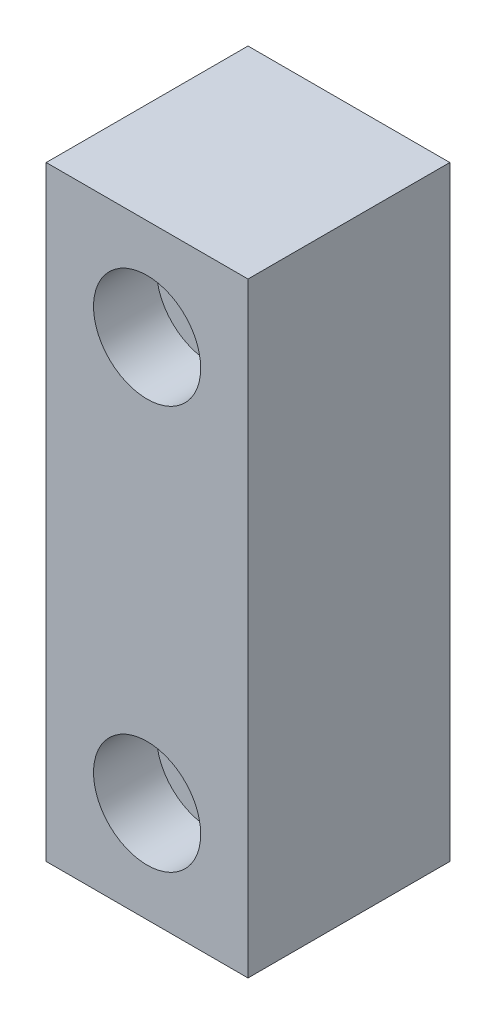
ISO-10303-21;
HEADER;
FILE_DESCRIPTION(('STEP AP214'),'2;1');
FILE_NAME('part.step','',(''),(''),'','','');
FILE_SCHEMA(('AUTOMOTIVE_DESIGN { 1 0 10303 214 1 1 1 1 }'));
ENDSEC;
DATA;
#1=APPLICATION_CONTEXT('core data for automotive mechanical design processes');
#2=APPLICATION_PROTOCOL_DEFINITION('international standard','automotive_design',2000,#1);
#3=PRODUCT_CONTEXT('',#1,'mechanical');
#4=PRODUCT('Part','Part','',(#3));
#5=PRODUCT_RELATED_PRODUCT_CATEGORY('part','',(#4));
#6=PRODUCT_DEFINITION_FORMATION('','',#4);
#7=PRODUCT_DEFINITION_CONTEXT('part definition',#1,'design');
#8=PRODUCT_DEFINITION('design','',#6,#7);
#9=PRODUCT_DEFINITION_SHAPE('','',#8);
#10=(LENGTH_UNIT() NAMED_UNIT(*) SI_UNIT(.MILLI.,.METRE.));
#11=(NAMED_UNIT(*) PLANE_ANGLE_UNIT() SI_UNIT($,.RADIAN.));
#12=(NAMED_UNIT(*) SI_UNIT($,.STERADIAN.) SOLID_ANGLE_UNIT());
#13=UNCERTAINTY_MEASURE_WITH_UNIT(LENGTH_MEASURE(1.E-05),#10,'distance_accuracy_value','');
#14=(GEOMETRIC_REPRESENTATION_CONTEXT(3) GLOBAL_UNCERTAINTY_ASSIGNED_CONTEXT((#13)) GLOBAL_UNIT_ASSIGNED_CONTEXT((#10,
#11,#12)) REPRESENTATION_CONTEXT('',''));
#15=CARTESIAN_POINT('',(0.,0.,0.));
#16=DIRECTION('',(0.,0.,1.));
#17=DIRECTION('',(1.,0.,0.));
#18=AXIS2_PLACEMENT_3D('',#15,#16,#17);
#19=CARTESIAN_POINT('',(0.,25.4,-63.5));
#20=DIRECTION('',(0.,0.,1.));
#21=DIRECTION('',(1.,0.,0.));
#22=AXIS2_PLACEMENT_3D('',#19,#20,#21);
#23=CYLINDRICAL_SURFACE('',#22,4.3688);
#24=CARTESIAN_POINT('',(0.,25.4,-12.7));
#25=DIRECTION('',(0.,0.,-1.));
#26=DIRECTION('',(-1.,0.,0.));
#27=AXIS2_PLACEMENT_3D('',#24,#25,#26);
#28=CIRCLE('',#27,4.3688);
#29=CARTESIAN_POINT('',(-4.3688,25.4,-12.7));
#30=VERTEX_POINT('',#29);
#31=EDGE_CURVE('E124',#30,#30,#28,.T.);
#32=ORIENTED_EDGE('',*,*,#31,.T.);
#33=EDGE_LOOP('',(#32));
#34=FACE_BOUND('',#33,.T.);
#35=CARTESIAN_POINT('',(0.,25.4,4.77519999999999));
#36=DIRECTION('',(0.,0.,1.));
#37=DIRECTION('',(1.,0.,0.));
#38=AXIS2_PLACEMENT_3D('',#35,#36,#37);
#39=CIRCLE('',#38,4.3688);
#40=CARTESIAN_POINT('',(4.3688,25.4,4.77519999999999));
#41=VERTEX_POINT('',#40);
#42=EDGE_CURVE('E47',#41,#41,#39,.F.);
#43=ORIENTED_EDGE('',*,*,#42,.F.);
#44=EDGE_LOOP('',(#43));
#45=FACE_BOUND('',#44,.T.);
#46=ADVANCED_FACE('F43',(#34,#45),#23,.F.);
#47=CARTESIAN_POINT('',(0.,-25.4,-63.5));
#48=DIRECTION('',(0.,0.,1.));
#49=DIRECTION('',(1.,0.,0.));
#50=AXIS2_PLACEMENT_3D('',#47,#48,#49);
#51=CYLINDRICAL_SURFACE('',#50,4.3688);
#52=CARTESIAN_POINT('',(0.,-25.4,-12.7));
#53=DIRECTION('',(0.,0.,-1.));
#54=DIRECTION('',(-1.,0.,0.));
#55=AXIS2_PLACEMENT_3D('',#52,#53,#54);
#56=CIRCLE('',#55,4.3688);
#57=CARTESIAN_POINT('',(-4.3688,-25.4,-12.7));
#58=VERTEX_POINT('',#57);
#59=EDGE_CURVE('E113',#58,#58,#56,.T.);
#60=ORIENTED_EDGE('',*,*,#59,.T.);
#61=EDGE_LOOP('',(#60));
#62=FACE_BOUND('',#61,.T.);
#63=CARTESIAN_POINT('',(0.,-25.4,4.77519999999999));
#64=DIRECTION('',(0.,0.,1.));
#65=DIRECTION('',(1.,0.,0.));
#66=AXIS2_PLACEMENT_3D('',#63,#64,#65);
#67=CIRCLE('',#66,4.3688);
#68=CARTESIAN_POINT('',(4.3688,-25.4,4.77519999999999));
#69=VERTEX_POINT('',#68);
#70=EDGE_CURVE('E121',#69,#69,#67,.F.);
#71=ORIENTED_EDGE('',*,*,#70,.F.);
#72=EDGE_LOOP('',(#71));
#73=FACE_BOUND('',#72,.T.);
#74=ADVANCED_FACE('F172',(#62,#73),#51,.F.);
#75=CARTESIAN_POINT('',(12.7,38.1,12.7));
#76=DIRECTION('',(0.,-1.,0.));
#77=DIRECTION('',(0.,0.,-1.));
#78=AXIS2_PLACEMENT_3D('',#75,#76,#77);
#79=PLANE('',#78);
#80=DIRECTION('',(-1.,0.,0.));
#81=VECTOR('',#80,1.);
#82=CARTESIAN_POINT('',(12.7,38.1,-12.7));
#83=LINE('',#82,#81);
#84=CARTESIAN_POINT('',(12.7,38.1,-12.7));
#85=VERTEX_POINT('',#84);
#86=CARTESIAN_POINT('',(-12.7,38.1,-12.7));
#87=VERTEX_POINT('',#86);
#88=EDGE_CURVE('E110',#85,#87,#83,.T.);
#89=ORIENTED_EDGE('',*,*,#88,.T.);
#90=DIRECTION('',(0.,0.,-1.));
#91=VECTOR('',#90,1.);
#92=CARTESIAN_POINT('',(-12.7,38.1,12.7));
#93=LINE('',#92,#91);
#94=CARTESIAN_POINT('',(-12.7,38.1,12.7));
#95=VERTEX_POINT('',#94);
#96=EDGE_CURVE('E11',#95,#87,#93,.T.);
#97=ORIENTED_EDGE('',*,*,#96,.F.);
#98=DIRECTION('',(-1.,0.,0.));
#99=VECTOR('',#98,1.);
#100=CARTESIAN_POINT('',(12.7,38.1,12.7));
#101=LINE('',#100,#99);
#102=CARTESIAN_POINT('',(12.7,38.1,12.7));
#103=VERTEX_POINT('',#102);
#104=EDGE_CURVE('E97',#103,#95,#101,.T.);
#105=ORIENTED_EDGE('',*,*,#104,.F.);
#106=DIRECTION('',(0.,0.,-1.));
#107=VECTOR('',#106,1.);
#108=CARTESIAN_POINT('',(12.7,38.1,12.7));
#109=LINE('',#108,#107);
#110=EDGE_CURVE('E106',#103,#85,#109,.T.);
#111=ORIENTED_EDGE('',*,*,#110,.T.);
#112=EDGE_LOOP('',(#89,#97,#105,#111));
#113=FACE_BOUND('',#112,.T.);
#114=ADVANCED_FACE('F45',(#113),#79,.F.);
#115=CARTESIAN_POINT('',(-12.7,-38.1,12.7));
#116=DIRECTION('',(1.,0.,0.));
#117=DIRECTION('',(0.,0.,-1.));
#118=AXIS2_PLACEMENT_3D('',#115,#116,#117);
#119=PLANE('',#118);
#120=DIRECTION('',(0.,-1.,0.));
#121=VECTOR('',#120,1.);
#122=CARTESIAN_POINT('',(-12.7,-38.1,-12.7));
#123=LINE('',#122,#121);
#124=CARTESIAN_POINT('',(-12.7,-38.1,-12.7));
#125=VERTEX_POINT('',#124);
#126=EDGE_CURVE('E101',#87,#125,#123,.T.);
#127=ORIENTED_EDGE('',*,*,#126,.T.);
#128=DIRECTION('',(0.,0.,-1.));
#129=VECTOR('',#128,1.);
#130=CARTESIAN_POINT('',(-12.7,-38.1,12.7));
#131=LINE('',#130,#129);
#132=CARTESIAN_POINT('',(-12.7,-38.1,12.7));
#133=VERTEX_POINT('',#132);
#134=EDGE_CURVE('E53',#133,#125,#131,.T.);
#135=ORIENTED_EDGE('',*,*,#134,.F.);
#136=DIRECTION('',(0.,-1.,0.));
#137=VECTOR('',#136,1.);
#138=CARTESIAN_POINT('',(-12.7,-38.1,12.7));
#139=LINE('',#138,#137);
#140=EDGE_CURVE('E92',#95,#133,#139,.T.);
#141=ORIENTED_EDGE('',*,*,#140,.F.);
#142=ORIENTED_EDGE('',*,*,#96,.T.);
#143=EDGE_LOOP('',(#127,#135,#141,#142));
#144=FACE_BOUND('',#143,.T.);
#145=ADVANCED_FACE('F100',(#144),#119,.F.);
#146=CARTESIAN_POINT('',(12.7,-38.1,12.7));
#147=DIRECTION('',(0.,1.,0.));
#148=DIRECTION('',(0.,0.,1.));
#149=AXIS2_PLACEMENT_3D('',#146,#147,#148);
#150=PLANE('',#149);
#151=DIRECTION('',(1.,0.,0.));
#152=VECTOR('',#151,1.);
#153=CARTESIAN_POINT('',(12.7,-38.1,-12.7));
#154=LINE('',#153,#152);
#155=CARTESIAN_POINT('',(12.7,-38.1,-12.7));
#156=VERTEX_POINT('',#155);
#157=EDGE_CURVE('E79',#125,#156,#154,.T.);
#158=ORIENTED_EDGE('',*,*,#157,.T.);
#159=DIRECTION('',(0.,0.,-1.));
#160=VECTOR('',#159,1.);
#161=CARTESIAN_POINT('',(12.7,-38.1,12.7));
#162=LINE('',#161,#160);
#163=CARTESIAN_POINT('',(12.7,-38.1,12.7));
#164=VERTEX_POINT('',#163);
#165=EDGE_CURVE('E102',#164,#156,#162,.T.);
#166=ORIENTED_EDGE('',*,*,#165,.F.);
#167=DIRECTION('',(1.,0.,0.));
#168=VECTOR('',#167,1.);
#169=CARTESIAN_POINT('',(12.7,-38.1,12.7));
#170=LINE('',#169,#168);
#171=EDGE_CURVE('E95',#133,#164,#170,.T.);
#172=ORIENTED_EDGE('',*,*,#171,.F.);
#173=ORIENTED_EDGE('',*,*,#134,.T.);
#174=EDGE_LOOP('',(#158,#166,#172,#173));
#175=FACE_BOUND('',#174,.T.);
#176=ADVANCED_FACE('F104',(#175),#150,.F.);
#177=CARTESIAN_POINT('',(12.7,-38.1,12.7));
#178=DIRECTION('',(-1.,0.,0.));
#179=DIRECTION('',(0.,0.,1.));
#180=AXIS2_PLACEMENT_3D('',#177,#178,#179);
#181=PLANE('',#180);
#182=DIRECTION('',(0.,1.,0.));
#183=VECTOR('',#182,1.);
#184=CARTESIAN_POINT('',(12.7,-38.1,-12.7));
#185=LINE('',#184,#183);
#186=EDGE_CURVE('E85',#156,#85,#185,.T.);
#187=ORIENTED_EDGE('',*,*,#186,.T.);
#188=ORIENTED_EDGE('',*,*,#110,.F.);
#189=DIRECTION('',(0.,1.,0.));
#190=VECTOR('',#189,1.);
#191=CARTESIAN_POINT('',(12.7,-38.1,12.7));
#192=LINE('',#191,#190);
#193=EDGE_CURVE('E62',#164,#103,#192,.T.);
#194=ORIENTED_EDGE('',*,*,#193,.F.);
#195=ORIENTED_EDGE('',*,*,#165,.T.);
#196=EDGE_LOOP('',(#187,#188,#194,#195));
#197=FACE_BOUND('',#196,.T.);
#198=ADVANCED_FACE('F158',(#197),#181,.F.);
#199=CARTESIAN_POINT('',(0.,0.,12.7));
#200=DIRECTION('',(0.,0.,-1.));
#201=DIRECTION('',(-1.,0.,0.));
#202=AXIS2_PLACEMENT_3D('',#199,#200,#201);
#203=PLANE('',#202);
#204=CARTESIAN_POINT('',(0.,25.4,12.7));
#205=DIRECTION('',(0.,0.,1.));
#206=DIRECTION('',(1.,0.,0.));
#207=AXIS2_PLACEMENT_3D('',#204,#205,#206);
#208=CIRCLE('',#207,6.7437);
#209=CARTESIAN_POINT('',(6.7437,25.4,12.7));
#210=VERTEX_POINT('',#209);
#211=EDGE_CURVE('E136',#210,#210,#208,.T.);
#212=ORIENTED_EDGE('',*,*,#211,.F.);
#213=EDGE_LOOP('',(#212));
#214=FACE_BOUND('',#213,.T.);
#215=CARTESIAN_POINT('',(0.,-25.4,12.7));
#216=DIRECTION('',(0.,0.,1.));
#217=DIRECTION('',(1.,0.,0.));
#218=AXIS2_PLACEMENT_3D('',#215,#216,#217);
#219=CIRCLE('',#218,6.7437);
#220=CARTESIAN_POINT('',(6.7437,-25.4,12.7));
#221=VERTEX_POINT('',#220);
#222=EDGE_CURVE('E126',#221,#221,#219,.T.);
#223=ORIENTED_EDGE('',*,*,#222,.F.);
#224=EDGE_LOOP('',(#223));
#225=FACE_BOUND('',#224,.T.);
#226=ORIENTED_EDGE('',*,*,#104,.T.);
#227=ORIENTED_EDGE('',*,*,#140,.T.);
#228=ORIENTED_EDGE('',*,*,#171,.T.);
#229=ORIENTED_EDGE('',*,*,#193,.T.);
#230=EDGE_LOOP('',(#226,#227,#228,#229));
#231=FACE_BOUND('',#230,.T.);
#232=ADVANCED_FACE('F93',(#214,#225,#231),#203,.F.);
#233=CARTESIAN_POINT('',(0.,0.,-12.7));
#234=DIRECTION('',(0.,0.,-1.));
#235=DIRECTION('',(-1.,0.,0.));
#236=AXIS2_PLACEMENT_3D('',#233,#234,#235);
#237=PLANE('',#236);
#238=ORIENTED_EDGE('',*,*,#31,.F.);
#239=EDGE_LOOP('',(#238));
#240=FACE_BOUND('',#239,.T.);
#241=ORIENTED_EDGE('',*,*,#59,.F.);
#242=EDGE_LOOP('',(#241));
#243=FACE_BOUND('',#242,.T.);
#244=ORIENTED_EDGE('',*,*,#88,.F.);
#245=ORIENTED_EDGE('',*,*,#186,.F.);
#246=ORIENTED_EDGE('',*,*,#157,.F.);
#247=ORIENTED_EDGE('',*,*,#126,.F.);
#248=EDGE_LOOP('',(#244,#245,#246,#247));
#249=FACE_BOUND('',#248,.T.);
#250=ADVANCED_FACE('F157',(#240,#243,#249),#237,.T.);
#251=CARTESIAN_POINT('',(0.,-25.4,4.7752));
#252=DIRECTION('',(0.,0.,1.));
#253=DIRECTION('',(1.,0.,0.));
#254=AXIS2_PLACEMENT_3D('',#251,#252,#253);
#255=PLANE('',#254);
#256=CARTESIAN_POINT('',(0.,-25.4,4.7752));
#257=DIRECTION('',(0.,0.,1.));
#258=DIRECTION('',(1.,0.,0.));
#259=AXIS2_PLACEMENT_3D('',#256,#257,#258);
#260=CIRCLE('',#259,6.7437);
#261=CARTESIAN_POINT('',(6.7437,-25.4,4.7752));
#262=VERTEX_POINT('',#261);
#263=EDGE_CURVE('E123',#262,#262,#260,.T.);
#264=ORIENTED_EDGE('',*,*,#263,.T.);
#265=EDGE_LOOP('',(#264));
#266=FACE_BOUND('',#265,.T.);
#267=ORIENTED_EDGE('',*,*,#70,.T.);
#268=EDGE_LOOP('',(#267));
#269=FACE_BOUND('',#268,.T.);
#270=ADVANCED_FACE('F146',(#266,#269),#255,.T.);
#271=CARTESIAN_POINT('',(0.,-25.4,4.7752));
#272=DIRECTION('',(0.,0.,1.));
#273=DIRECTION('',(1.,0.,0.));
#274=AXIS2_PLACEMENT_3D('',#271,#272,#273);
#275=CYLINDRICAL_SURFACE('',#274,6.7437);
#276=ORIENTED_EDGE('',*,*,#263,.F.);
#277=EDGE_LOOP('',(#276));
#278=FACE_BOUND('',#277,.T.);
#279=ORIENTED_EDGE('',*,*,#222,.T.);
#280=EDGE_LOOP('',(#279));
#281=FACE_BOUND('',#280,.T.);
#282=ADVANCED_FACE('F149',(#278,#281),#275,.F.);
#283=CARTESIAN_POINT('',(0.,25.4,4.7752));
#284=DIRECTION('',(0.,0.,1.));
#285=DIRECTION('',(1.,0.,0.));
#286=AXIS2_PLACEMENT_3D('',#283,#284,#285);
#287=PLANE('',#286);
#288=CARTESIAN_POINT('',(0.,25.4,4.7752));
#289=DIRECTION('',(0.,0.,1.));
#290=DIRECTION('',(1.,0.,0.));
#291=AXIS2_PLACEMENT_3D('',#288,#289,#290);
#292=CIRCLE('',#291,6.7437);
#293=CARTESIAN_POINT('',(6.7437,25.4,4.7752));
#294=VERTEX_POINT('',#293);
#295=EDGE_CURVE('E132',#294,#294,#292,.T.);
#296=ORIENTED_EDGE('',*,*,#295,.T.);
#297=EDGE_LOOP('',(#296));
#298=FACE_BOUND('',#297,.T.);
#299=ORIENTED_EDGE('',*,*,#42,.T.);
#300=EDGE_LOOP('',(#299));
#301=FACE_BOUND('',#300,.T.);
#302=ADVANCED_FACE('F152',(#298,#301),#287,.T.);
#303=CARTESIAN_POINT('',(0.,25.4,4.7752));
#304=DIRECTION('',(0.,0.,1.));
#305=DIRECTION('',(1.,0.,0.));
#306=AXIS2_PLACEMENT_3D('',#303,#304,#305);
#307=CYLINDRICAL_SURFACE('',#306,6.7437);
#308=ORIENTED_EDGE('',*,*,#295,.F.);
#309=EDGE_LOOP('',(#308));
#310=FACE_BOUND('',#309,.T.);
#311=ORIENTED_EDGE('',*,*,#211,.T.);
#312=EDGE_LOOP('',(#311));
#313=FACE_BOUND('',#312,.T.);
#314=ADVANCED_FACE('F181',(#310,#313),#307,.F.);
#315=CLOSED_SHELL('',(#46,#74,#114,#145,#176,#198,#232,#250,#270,#282,#302,#314));
#316=MANIFOLD_SOLID_BREP('B2',#315);
#317=ADVANCED_BREP_SHAPE_REPRESENTATION('',(#18,#316),#14);
#318=SHAPE_DEFINITION_REPRESENTATION(#9,#317);
ENDSEC;
END-ISO-10303-21;
